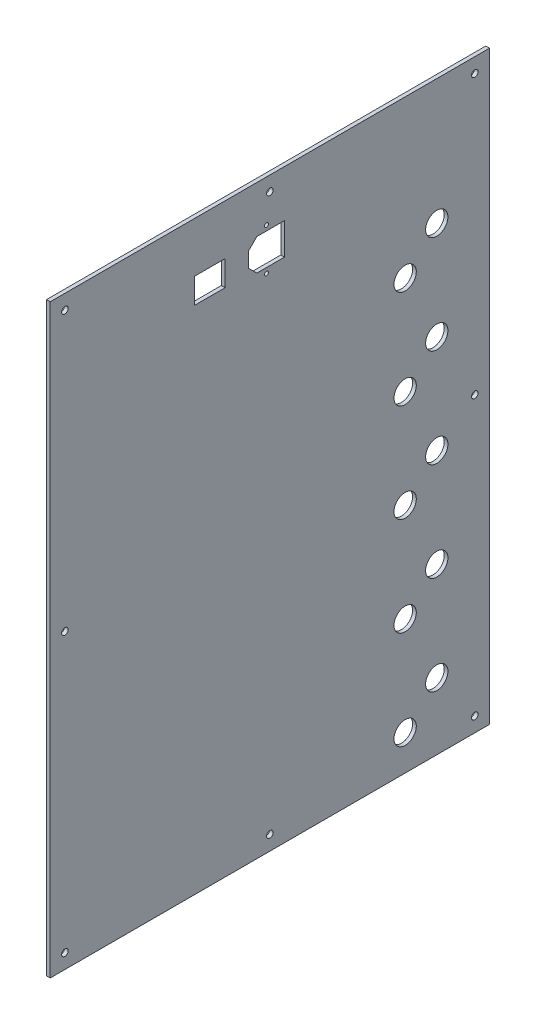
ISO-10303-21;
HEADER;
FILE_DESCRIPTION(('STEP AP214'),'2;1');
FILE_NAME('part.step','',(''),(''),'','','');
FILE_SCHEMA(('AUTOMOTIVE_DESIGN { 1 0 10303 214 1 1 1 1 }'));
ENDSEC;
DATA;
#1=APPLICATION_CONTEXT('core data for automotive mechanical design processes');
#2=APPLICATION_PROTOCOL_DEFINITION('international standard','automotive_design',2000,#1);
#3=PRODUCT_CONTEXT('',#1,'mechanical');
#4=PRODUCT('Part','Part','',(#3));
#5=PRODUCT_RELATED_PRODUCT_CATEGORY('part','',(#4));
#6=PRODUCT_DEFINITION_FORMATION('','',#4);
#7=PRODUCT_DEFINITION_CONTEXT('part definition',#1,'design');
#8=PRODUCT_DEFINITION('design','',#6,#7);
#9=PRODUCT_DEFINITION_SHAPE('','',#8);
#10=(LENGTH_UNIT() NAMED_UNIT(*) SI_UNIT(.MILLI.,.METRE.));
#11=(NAMED_UNIT(*) PLANE_ANGLE_UNIT() SI_UNIT($,.RADIAN.));
#12=(NAMED_UNIT(*) SI_UNIT($,.STERADIAN.) SOLID_ANGLE_UNIT());
#13=UNCERTAINTY_MEASURE_WITH_UNIT(LENGTH_MEASURE(1.E-05),#10,'distance_accuracy_value','');
#14=(GEOMETRIC_REPRESENTATION_CONTEXT(3) GLOBAL_UNCERTAINTY_ASSIGNED_CONTEXT((#13)) GLOBAL_UNIT_ASSIGNED_CONTEXT((#10,
#11,#12)) REPRESENTATION_CONTEXT('',''));
#15=CARTESIAN_POINT('',(0.,0.,0.));
#16=DIRECTION('',(0.,0.,1.));
#17=DIRECTION('',(1.,0.,0.));
#18=AXIS2_PLACEMENT_3D('',#15,#16,#17);
#19=CARTESIAN_POINT('',(3.175,0.,0.));
#20=DIRECTION('',(-1.,0.,0.));
#21=DIRECTION('',(0.,0.,1.));
#22=AXIS2_PLACEMENT_3D('',#19,#20,#21);
#23=PLANE('',#22);
#24=DIRECTION('',(0.,1.,0.));
#25=VECTOR('',#24,1.);
#26=CARTESIAN_POINT('',(3.175,207.25,38.234));
#27=LINE('',#26,#25);
#28=CARTESIAN_POINT('',(3.175,185.75,38.234));
#29=VERTEX_POINT('',#28);
#30=CARTESIAN_POINT('',(3.175,207.25,38.234));
#31=VERTEX_POINT('',#30);
#32=EDGE_CURVE('E181',#29,#31,#27,.T.);
#33=ORIENTED_EDGE('',*,*,#32,.F.);
#34=DIRECTION('',(0.,0.,-1.));
#35=VECTOR('',#34,1.);
#36=CARTESIAN_POINT('',(3.175,185.75,64.234));
#37=LINE('',#36,#35);
#38=CARTESIAN_POINT('',(3.175,185.75,64.234));
#39=VERTEX_POINT('',#38);
#40=EDGE_CURVE('E61',#39,#29,#37,.T.);
#41=ORIENTED_EDGE('',*,*,#40,.F.);
#42=DIRECTION('',(0.,-1.,0.));
#43=VECTOR('',#42,1.);
#44=CARTESIAN_POINT('',(3.175,207.25,64.234));
#45=LINE('',#44,#43);
#46=CARTESIAN_POINT('',(3.175,207.25,64.234));
#47=VERTEX_POINT('',#46);
#48=EDGE_CURVE('E168',#47,#39,#45,.T.);
#49=ORIENTED_EDGE('',*,*,#48,.F.);
#50=DIRECTION('',(0.,0.,1.));
#51=VECTOR('',#50,1.);
#52=CARTESIAN_POINT('',(3.175,207.25,64.234));
#53=LINE('',#52,#51);
#54=EDGE_CURVE('E172',#31,#47,#53,.T.);
#55=ORIENTED_EDGE('',*,*,#54,.F.);
#56=EDGE_LOOP('',(#33,#41,#49,#55));
#57=FACE_BOUND('',#56,.T.);
#58=CARTESIAN_POINT('',(3.175,178.593,2.89999999999999));
#59=DIRECTION('',(1.,0.,0.));
#60=DIRECTION('',(0.,0.,-1.));
#61=AXIS2_PLACEMENT_3D('',#58,#59,#60);
#62=CIRCLE('',#61,1.70000000000001);
#63=CARTESIAN_POINT('',(3.175,178.593,1.19999999999997));
#64=VERTEX_POINT('',#63);
#65=EDGE_CURVE('E201',#64,#64,#62,.T.);
#66=ORIENTED_EDGE('',*,*,#65,.F.);
#67=EDGE_LOOP('',(#66));
#68=FACE_BOUND('',#67,.T.);
#69=CARTESIAN_POINT('',(3.175,214.407,2.89999999999999));
#70=DIRECTION('',(1.,0.,0.));
#71=DIRECTION('',(0.,0.,-1.));
#72=AXIS2_PLACEMENT_3D('',#69,#70,#71);
#73=CIRCLE('',#72,1.70000000000001);
#74=CARTESIAN_POINT('',(3.175,214.407,1.19999999999998));
#75=VERTEX_POINT('',#74);
#76=EDGE_CURVE('E205',#75,#75,#73,.T.);
#77=ORIENTED_EDGE('',*,*,#76,.F.);
#78=EDGE_LOOP('',(#77));
#79=FACE_BOUND('',#78,.T.);
#80=DIRECTION('',(0.,-0.707106781186548,0.707106781186547));
#81=VECTOR('',#80,1.);
#82=CARTESIAN_POINT('',(3.175,210.,11.122));
#83=LINE('',#82,#81);
#84=CARTESIAN_POINT('',(3.175,210.,11.122));
#85=VERTEX_POINT('',#84);
#86=CARTESIAN_POINT('',(3.175,202.888,18.234));
#87=VERTEX_POINT('',#86);
#88=EDGE_CURVE('E240',#85,#87,#83,.T.);
#89=ORIENTED_EDGE('',*,*,#88,.F.);
#90=DIRECTION('',(0.,0.,1.));
#91=VECTOR('',#90,1.);
#92=CARTESIAN_POINT('',(3.175,210.,-12.5));
#93=LINE('',#92,#91);
#94=CARTESIAN_POINT('',(3.175,210.,-12.5));
#95=VERTEX_POINT('',#94);
#96=EDGE_CURVE('E200',#95,#85,#93,.T.);
#97=ORIENTED_EDGE('',*,*,#96,.F.);
#98=DIRECTION('',(0.,1.,0.));
#99=VECTOR('',#98,1.);
#100=CARTESIAN_POINT('',(3.175,210.,-12.5));
#101=LINE('',#100,#99);
#102=CARTESIAN_POINT('',(3.175,183.,-12.5));
#103=VERTEX_POINT('',#102);
#104=EDGE_CURVE('E217',#103,#95,#101,.T.);
#105=ORIENTED_EDGE('',*,*,#104,.F.);
#106=DIRECTION('',(0.,0.,-1.));
#107=VECTOR('',#106,1.);
#108=CARTESIAN_POINT('',(3.175,183.,-12.5));
#109=LINE('',#108,#107);
#110=CARTESIAN_POINT('',(3.175,183.,11.122));
#111=VERTEX_POINT('',#110);
#112=EDGE_CURVE('E252',#111,#103,#109,.T.);
#113=ORIENTED_EDGE('',*,*,#112,.F.);
#114=DIRECTION('',(0.,-0.707106781186548,-0.707106781186547));
#115=VECTOR('',#114,1.);
#116=CARTESIAN_POINT('',(3.175,190.112,18.234));
#117=LINE('',#116,#115);
#118=CARTESIAN_POINT('',(3.175,190.112,18.234));
#119=VERTEX_POINT('',#118);
#120=EDGE_CURVE('E248',#119,#111,#117,.T.);
#121=ORIENTED_EDGE('',*,*,#120,.F.);
#122=DIRECTION('',(0.,-1.,0.));
#123=VECTOR('',#122,1.);
#124=CARTESIAN_POINT('',(3.175,202.888,18.234));
#125=LINE('',#124,#123);
#126=EDGE_CURVE('E244',#87,#119,#125,.T.);
#127=ORIENTED_EDGE('',*,*,#126,.F.);
#128=EDGE_LOOP('',(#89,#97,#105,#113,#121,#127));
#129=FACE_BOUND('',#128,.T.);
#130=CARTESIAN_POINT('',(3.175,-220.,-115.5));
#131=DIRECTION('',(1.,0.,0.));
#132=DIRECTION('',(0.,0.,-1.));
#133=AXIS2_PLACEMENT_3D('',#130,#131,#132);
#134=CIRCLE('',#133,9.525);
#135=CARTESIAN_POINT('',(3.175,-220.,-125.025));
#136=VERTEX_POINT('',#135);
#137=EDGE_CURVE('E283',#136,#136,#134,.T.);
#138=ORIENTED_EDGE('',*,*,#137,.F.);
#139=EDGE_LOOP('',(#138));
#140=FACE_BOUND('',#139,.T.);
#141=CARTESIAN_POINT('',(3.175,-193.,-142.5));
#142=DIRECTION('',(1.,0.,0.));
#143=DIRECTION('',(0.,0.,-1.));
#144=AXIS2_PLACEMENT_3D('',#141,#142,#143);
#145=CIRCLE('',#144,9.52499999999999);
#146=CARTESIAN_POINT('',(3.175,-193.,-152.025));
#147=VERTEX_POINT('',#146);
#148=EDGE_CURVE('E287',#147,#147,#145,.T.);
#149=ORIENTED_EDGE('',*,*,#148,.F.);
#150=EDGE_LOOP('',(#149));
#151=FACE_BOUND('',#150,.T.);
#152=CARTESIAN_POINT('',(3.175,-136.,-115.5));
#153=DIRECTION('',(1.,0.,0.));
#154=DIRECTION('',(0.,0.,-1.));
#155=AXIS2_PLACEMENT_3D('',#152,#153,#154);
#156=CIRCLE('',#155,9.52500000000002);
#157=CARTESIAN_POINT('',(3.175,-136.,-125.025));
#158=VERTEX_POINT('',#157);
#159=EDGE_CURVE('E295',#158,#158,#156,.T.);
#160=ORIENTED_EDGE('',*,*,#159,.F.);
#161=EDGE_LOOP('',(#160));
#162=FACE_BOUND('',#161,.T.);
#163=CARTESIAN_POINT('',(3.175,-109.,-142.5));
#164=DIRECTION('',(1.,0.,0.));
#165=DIRECTION('',(0.,0.,-1.));
#166=AXIS2_PLACEMENT_3D('',#163,#164,#165);
#167=CIRCLE('',#166,9.52499999999999);
#168=CARTESIAN_POINT('',(3.175,-109.,-152.025));
#169=VERTEX_POINT('',#168);
#170=EDGE_CURVE('E303',#169,#169,#167,.T.);
#171=ORIENTED_EDGE('',*,*,#170,.F.);
#172=EDGE_LOOP('',(#171));
#173=FACE_BOUND('',#172,.T.);
#174=CARTESIAN_POINT('',(3.175,-52.,-115.5));
#175=DIRECTION('',(1.,0.,0.));
#176=DIRECTION('',(0.,0.,-1.));
#177=AXIS2_PLACEMENT_3D('',#174,#175,#176);
#178=CIRCLE('',#177,9.525);
#179=CARTESIAN_POINT('',(3.175,-52.,-125.025));
#180=VERTEX_POINT('',#179);
#181=EDGE_CURVE('E311',#180,#180,#178,.T.);
#182=ORIENTED_EDGE('',*,*,#181,.F.);
#183=EDGE_LOOP('',(#182));
#184=FACE_BOUND('',#183,.T.);
#185=CARTESIAN_POINT('',(3.175,-24.9999999999997,-142.5));
#186=DIRECTION('',(1.,0.,0.));
#187=DIRECTION('',(0.,0.,-1.));
#188=AXIS2_PLACEMENT_3D('',#185,#186,#187);
#189=CIRCLE('',#188,9.52499999999998);
#190=CARTESIAN_POINT('',(3.175,-24.9999999999997,-152.025));
#191=VERTEX_POINT('',#190);
#192=EDGE_CURVE('E319',#191,#191,#189,.T.);
#193=ORIENTED_EDGE('',*,*,#192,.F.);
#194=EDGE_LOOP('',(#193));
#195=FACE_BOUND('',#194,.T.);
#196=CARTESIAN_POINT('',(3.175,32.,-115.5));
#197=DIRECTION('',(1.,0.,0.));
#198=DIRECTION('',(0.,0.,-1.));
#199=AXIS2_PLACEMENT_3D('',#196,#197,#198);
#200=CIRCLE('',#199,9.525);
#201=CARTESIAN_POINT('',(3.175,32.,-125.025));
#202=VERTEX_POINT('',#201);
#203=EDGE_CURVE('E327',#202,#202,#200,.T.);
#204=ORIENTED_EDGE('',*,*,#203,.F.);
#205=EDGE_LOOP('',(#204));
#206=FACE_BOUND('',#205,.T.);
#207=CARTESIAN_POINT('',(3.175,59.0000000000003,-142.5));
#208=DIRECTION('',(1.,0.,0.));
#209=DIRECTION('',(0.,0.,-1.));
#210=AXIS2_PLACEMENT_3D('',#207,#208,#209);
#211=CIRCLE('',#210,9.52499999999999);
#212=CARTESIAN_POINT('',(3.175,59.0000000000003,-152.025));
#213=VERTEX_POINT('',#212);
#214=EDGE_CURVE('E335',#213,#213,#211,.T.);
#215=ORIENTED_EDGE('',*,*,#214,.F.);
#216=EDGE_LOOP('',(#215));
#217=FACE_BOUND('',#216,.T.);
#218=CARTESIAN_POINT('',(3.175,116.,-115.5));
#219=DIRECTION('',(1.,0.,0.));
#220=DIRECTION('',(0.,0.,-1.));
#221=AXIS2_PLACEMENT_3D('',#218,#219,#220);
#222=CIRCLE('',#221,9.525);
#223=CARTESIAN_POINT('',(3.175,116.,-125.025));
#224=VERTEX_POINT('',#223);
#225=EDGE_CURVE('E343',#224,#224,#222,.T.);
#226=ORIENTED_EDGE('',*,*,#225,.F.);
#227=EDGE_LOOP('',(#226));
#228=FACE_BOUND('',#227,.T.);
#229=CARTESIAN_POINT('',(3.175,143.,-142.5));
#230=DIRECTION('',(1.,0.,0.));
#231=DIRECTION('',(0.,0.,-1.));
#232=AXIS2_PLACEMENT_3D('',#229,#230,#231);
#233=CIRCLE('',#232,9.52499999999999);
#234=CARTESIAN_POINT('',(3.175,143.,-152.025));
#235=VERTEX_POINT('',#234);
#236=EDGE_CURVE('E351',#235,#235,#233,.T.);
#237=ORIENTED_EDGE('',*,*,#236,.F.);
#238=EDGE_LOOP('',(#237));
#239=FACE_BOUND('',#238,.T.);
#240=DIRECTION('',(0.,0.,1.));
#241=VECTOR('',#240,1.);
#242=CARTESIAN_POINT('',(3.175,250.,-187.5));
#243=LINE('',#242,#241);
#244=CARTESIAN_POINT('',(3.175,250.,-187.5));
#245=VERTEX_POINT('',#244);
#246=CARTESIAN_POINT('',(3.175,250.,187.5));
#247=VERTEX_POINT('',#246);
#248=EDGE_CURVE('E422',#245,#247,#243,.T.);
#249=ORIENTED_EDGE('',*,*,#248,.T.);
#250=DIRECTION('',(0.,-1.,0.));
#251=VECTOR('',#250,1.);
#252=CARTESIAN_POINT('',(3.175,-250.,187.5));
#253=LINE('',#252,#251);
#254=CARTESIAN_POINT('',(3.175,-250.,187.5));
#255=VERTEX_POINT('',#254);
#256=EDGE_CURVE('E426',#247,#255,#253,.T.);
#257=ORIENTED_EDGE('',*,*,#256,.T.);
#258=DIRECTION('',(0.,0.,-1.));
#259=VECTOR('',#258,1.);
#260=CARTESIAN_POINT('',(3.175,-250.,-187.5));
#261=LINE('',#260,#259);
#262=CARTESIAN_POINT('',(3.175,-250.,-187.5));
#263=VERTEX_POINT('',#262);
#264=EDGE_CURVE('E430',#255,#263,#261,.T.);
#265=ORIENTED_EDGE('',*,*,#264,.T.);
#266=DIRECTION('',(0.,1.,0.));
#267=VECTOR('',#266,1.);
#268=CARTESIAN_POINT('',(3.175,-250.,-187.5));
#269=LINE('',#268,#267);
#270=EDGE_CURVE('E433',#263,#245,#269,.T.);
#271=ORIENTED_EDGE('',*,*,#270,.T.);
#272=EDGE_LOOP('',(#249,#257,#265,#271));
#273=FACE_BOUND('',#272,.T.);
#274=CARTESIAN_POINT('',(3.175,-237.5,175.));
#275=DIRECTION('',(1.,0.,0.));
#276=DIRECTION('',(0.,0.,-1.));
#277=AXIS2_PLACEMENT_3D('',#274,#275,#276);
#278=CIRCLE('',#277,2.8);
#279=CARTESIAN_POINT('',(3.175,-237.5,172.2));
#280=VERTEX_POINT('',#279);
#281=EDGE_CURVE('E414',#280,#280,#278,.T.);
#282=ORIENTED_EDGE('',*,*,#281,.F.);
#283=EDGE_LOOP('',(#282));
#284=FACE_BOUND('',#283,.T.);
#285=CARTESIAN_POINT('',(3.175,237.5,175.));
#286=DIRECTION('',(1.,0.,0.));
#287=DIRECTION('',(0.,0.,-1.));
#288=AXIS2_PLACEMENT_3D('',#285,#286,#287);
#289=CIRCLE('',#288,2.8);
#290=CARTESIAN_POINT('',(3.175,237.5,172.2));
#291=VERTEX_POINT('',#290);
#292=EDGE_CURVE('E406',#291,#291,#289,.T.);
#293=ORIENTED_EDGE('',*,*,#292,.F.);
#294=EDGE_LOOP('',(#293));
#295=FACE_BOUND('',#294,.T.);
#296=CARTESIAN_POINT('',(3.175,237.5,-175.));
#297=DIRECTION('',(1.,0.,0.));
#298=DIRECTION('',(0.,0.,-1.));
#299=AXIS2_PLACEMENT_3D('',#296,#297,#298);
#300=CIRCLE('',#299,2.8);
#301=CARTESIAN_POINT('',(3.175,237.5,-177.8));
#302=VERTEX_POINT('',#301);
#303=EDGE_CURVE('E398',#302,#302,#300,.T.);
#304=ORIENTED_EDGE('',*,*,#303,.F.);
#305=EDGE_LOOP('',(#304));
#306=FACE_BOUND('',#305,.T.);
#307=CARTESIAN_POINT('',(3.175,-237.5,-175.));
#308=DIRECTION('',(1.,0.,0.));
#309=DIRECTION('',(0.,0.,-1.));
#310=AXIS2_PLACEMENT_3D('',#307,#308,#309);
#311=CIRCLE('',#310,2.8);
#312=CARTESIAN_POINT('',(3.175,-237.5,-177.8));
#313=VERTEX_POINT('',#312);
#314=EDGE_CURVE('E390',#313,#313,#311,.T.);
#315=ORIENTED_EDGE('',*,*,#314,.F.);
#316=EDGE_LOOP('',(#315));
#317=FACE_BOUND('',#316,.T.);
#318=CARTESIAN_POINT('',(3.175,-237.5,0.));
#319=DIRECTION('',(1.,0.,0.));
#320=DIRECTION('',(0.,0.,-1.));
#321=AXIS2_PLACEMENT_3D('',#318,#319,#320);
#322=CIRCLE('',#321,2.80000000000001);
#323=CARTESIAN_POINT('',(3.175,-237.5,-2.79999999999998));
#324=VERTEX_POINT('',#323);
#325=EDGE_CURVE('E382',#324,#324,#322,.T.);
#326=ORIENTED_EDGE('',*,*,#325,.F.);
#327=EDGE_LOOP('',(#326));
#328=FACE_BOUND('',#327,.T.);
#329=CARTESIAN_POINT('',(3.175,0.,175.));
#330=DIRECTION('',(1.,0.,0.));
#331=DIRECTION('',(0.,0.,-1.));
#332=AXIS2_PLACEMENT_3D('',#329,#330,#331);
#333=CIRCLE('',#332,2.8);
#334=CARTESIAN_POINT('',(3.175,0.,172.2));
#335=VERTEX_POINT('',#334);
#336=EDGE_CURVE('E374',#335,#335,#333,.T.);
#337=ORIENTED_EDGE('',*,*,#336,.F.);
#338=EDGE_LOOP('',(#337));
#339=FACE_BOUND('',#338,.T.);
#340=CARTESIAN_POINT('',(3.175,237.5,0.));
#341=DIRECTION('',(1.,0.,0.));
#342=DIRECTION('',(0.,0.,-1.));
#343=AXIS2_PLACEMENT_3D('',#340,#341,#342);
#344=CIRCLE('',#343,2.80000000000001);
#345=CARTESIAN_POINT('',(3.175,237.5,-2.79999999999998));
#346=VERTEX_POINT('',#345);
#347=EDGE_CURVE('E366',#346,#346,#344,.T.);
#348=ORIENTED_EDGE('',*,*,#347,.F.);
#349=EDGE_LOOP('',(#348));
#350=FACE_BOUND('',#349,.T.);
#351=CARTESIAN_POINT('',(3.175,0.,-175.));
#352=DIRECTION('',(1.,0.,0.));
#353=DIRECTION('',(0.,0.,-1.));
#354=AXIS2_PLACEMENT_3D('',#351,#352,#353);
#355=CIRCLE('',#354,2.8);
#356=CARTESIAN_POINT('',(3.175,0.,-177.8));
#357=VERTEX_POINT('',#356);
#358=EDGE_CURVE('E358',#357,#357,#355,.T.);
#359=ORIENTED_EDGE('',*,*,#358,.F.);
#360=EDGE_LOOP('',(#359));
#361=FACE_BOUND('',#360,.T.);
#362=ADVANCED_FACE('F45',(#57,#68,#79,#129,#140,#151,#162,#173,#184,#195,#206,#217,#228,#239,
#273,#284,#295,#306,#317,#328,#339,#350,#361),#23,.F.);
#363=CARTESIAN_POINT('',(0.,0.,0.));
#364=DIRECTION('',(-1.,0.,0.));
#365=DIRECTION('',(0.,0.,1.));
#366=AXIS2_PLACEMENT_3D('',#363,#364,#365);
#367=PLANE('',#366);
#368=DIRECTION('',(0.,0.,-1.));
#369=VECTOR('',#368,1.);
#370=CARTESIAN_POINT('',(0.,185.75,64.234));
#371=LINE('',#370,#369);
#372=CARTESIAN_POINT('',(0.,185.75,64.234));
#373=VERTEX_POINT('',#372);
#374=CARTESIAN_POINT('',(0.,185.75,38.234));
#375=VERTEX_POINT('',#374);
#376=EDGE_CURVE('E149',#373,#375,#371,.T.);
#377=ORIENTED_EDGE('',*,*,#376,.T.);
#378=DIRECTION('',(0.,1.,0.));
#379=VECTOR('',#378,1.);
#380=CARTESIAN_POINT('',(0.,207.25,38.234));
#381=LINE('',#380,#379);
#382=CARTESIAN_POINT('',(0.,207.25,38.234));
#383=VERTEX_POINT('',#382);
#384=EDGE_CURVE('E159',#375,#383,#381,.T.);
#385=ORIENTED_EDGE('',*,*,#384,.T.);
#386=DIRECTION('',(0.,0.,1.));
#387=VECTOR('',#386,1.);
#388=CARTESIAN_POINT('',(0.,207.25,64.234));
#389=LINE('',#388,#387);
#390=CARTESIAN_POINT('',(0.,207.25,64.234));
#391=VERTEX_POINT('',#390);
#392=EDGE_CURVE('E69',#383,#391,#389,.T.);
#393=ORIENTED_EDGE('',*,*,#392,.T.);
#394=DIRECTION('',(0.,-1.,0.));
#395=VECTOR('',#394,1.);
#396=CARTESIAN_POINT('',(0.,207.25,64.234));
#397=LINE('',#396,#395);
#398=EDGE_CURVE('E156',#391,#373,#397,.T.);
#399=ORIENTED_EDGE('',*,*,#398,.T.);
#400=EDGE_LOOP('',(#377,#385,#393,#399));
#401=FACE_BOUND('',#400,.T.);
#402=CARTESIAN_POINT('',(0.,178.593,2.89999999999999));
#403=DIRECTION('',(1.,0.,0.));
#404=DIRECTION('',(0.,0.,-1.));
#405=AXIS2_PLACEMENT_3D('',#402,#403,#404);
#406=CIRCLE('',#405,1.70000000000001);
#407=CARTESIAN_POINT('',(0.,178.593,1.19999999999997));
#408=VERTEX_POINT('',#407);
#409=EDGE_CURVE('E196',#408,#408,#406,.T.);
#410=ORIENTED_EDGE('',*,*,#409,.T.);
#411=EDGE_LOOP('',(#410));
#412=FACE_BOUND('',#411,.T.);
#413=CARTESIAN_POINT('',(0.,214.407,2.89999999999999));
#414=DIRECTION('',(1.,0.,0.));
#415=DIRECTION('',(0.,0.,-1.));
#416=AXIS2_PLACEMENT_3D('',#413,#414,#415);
#417=CIRCLE('',#416,1.70000000000001);
#418=CARTESIAN_POINT('',(0.,214.407,1.19999999999998));
#419=VERTEX_POINT('',#418);
#420=EDGE_CURVE('E190',#419,#419,#417,.T.);
#421=ORIENTED_EDGE('',*,*,#420,.T.);
#422=EDGE_LOOP('',(#421));
#423=FACE_BOUND('',#422,.T.);
#424=DIRECTION('',(0.,0.,1.));
#425=VECTOR('',#424,1.);
#426=CARTESIAN_POINT('',(0.,210.,-12.5));
#427=LINE('',#426,#425);
#428=CARTESIAN_POINT('',(0.,210.,-12.5));
#429=VERTEX_POINT('',#428);
#430=CARTESIAN_POINT('',(0.,210.,11.122));
#431=VERTEX_POINT('',#430);
#432=EDGE_CURVE('E212',#429,#431,#427,.T.);
#433=ORIENTED_EDGE('',*,*,#432,.T.);
#434=DIRECTION('',(0.,-0.707106781186548,0.707106781186547));
#435=VECTOR('',#434,1.);
#436=CARTESIAN_POINT('',(0.,210.,11.122));
#437=LINE('',#436,#435);
#438=CARTESIAN_POINT('',(0.,202.888,18.234));
#439=VERTEX_POINT('',#438);
#440=EDGE_CURVE('E216',#431,#439,#437,.T.);
#441=ORIENTED_EDGE('',*,*,#440,.T.);
#442=DIRECTION('',(0.,-1.,0.));
#443=VECTOR('',#442,1.);
#444=CARTESIAN_POINT('',(0.,202.888,18.234));
#445=LINE('',#444,#443);
#446=CARTESIAN_POINT('',(0.,190.112,18.234));
#447=VERTEX_POINT('',#446);
#448=EDGE_CURVE('E221',#439,#447,#445,.T.);
#449=ORIENTED_EDGE('',*,*,#448,.T.);
#450=DIRECTION('',(0.,-0.707106781186548,-0.707106781186547));
#451=VECTOR('',#450,1.);
#452=CARTESIAN_POINT('',(0.,190.112,18.234));
#453=LINE('',#452,#451);
#454=CARTESIAN_POINT('',(0.,183.,11.122));
#455=VERTEX_POINT('',#454);
#456=EDGE_CURVE('E225',#447,#455,#453,.T.);
#457=ORIENTED_EDGE('',*,*,#456,.T.);
#458=DIRECTION('',(0.,0.,-1.));
#459=VECTOR('',#458,1.);
#460=CARTESIAN_POINT('',(0.,183.,-12.5));
#461=LINE('',#460,#459);
#462=CARTESIAN_POINT('',(0.,183.,-12.5));
#463=VERTEX_POINT('',#462);
#464=EDGE_CURVE('E229',#455,#463,#461,.T.);
#465=ORIENTED_EDGE('',*,*,#464,.T.);
#466=DIRECTION('',(0.,1.,0.));
#467=VECTOR('',#466,1.);
#468=CARTESIAN_POINT('',(0.,210.,-12.5));
#469=LINE('',#468,#467);
#470=EDGE_CURVE('E233',#463,#429,#469,.T.);
#471=ORIENTED_EDGE('',*,*,#470,.T.);
#472=EDGE_LOOP('',(#433,#441,#449,#457,#465,#471));
#473=FACE_BOUND('',#472,.T.);
#474=CARTESIAN_POINT('',(0.,-220.,-115.5));
#475=DIRECTION('',(1.,0.,0.));
#476=DIRECTION('',(0.,0.,-1.));
#477=AXIS2_PLACEMENT_3D('',#474,#475,#476);
#478=CIRCLE('',#477,9.525);
#479=CARTESIAN_POINT('',(0.,-220.,-125.025));
#480=VERTEX_POINT('',#479);
#481=EDGE_CURVE('E278',#480,#480,#478,.T.);
#482=ORIENTED_EDGE('',*,*,#481,.T.);
#483=EDGE_LOOP('',(#482));
#484=FACE_BOUND('',#483,.T.);
#485=CARTESIAN_POINT('',(0.,-193.,-142.5));
#486=DIRECTION('',(1.,0.,0.));
#487=DIRECTION('',(0.,0.,-1.));
#488=AXIS2_PLACEMENT_3D('',#485,#486,#487);
#489=CIRCLE('',#488,9.52499999999999);
#490=CARTESIAN_POINT('',(0.,-193.,-152.025));
#491=VERTEX_POINT('',#490);
#492=EDGE_CURVE('E291',#491,#491,#489,.T.);
#493=ORIENTED_EDGE('',*,*,#492,.T.);
#494=EDGE_LOOP('',(#493));
#495=FACE_BOUND('',#494,.T.);
#496=CARTESIAN_POINT('',(0.,-136.,-115.5));
#497=DIRECTION('',(1.,0.,0.));
#498=DIRECTION('',(0.,0.,-1.));
#499=AXIS2_PLACEMENT_3D('',#496,#497,#498);
#500=CIRCLE('',#499,9.52500000000002);
#501=CARTESIAN_POINT('',(0.,-136.,-125.025));
#502=VERTEX_POINT('',#501);
#503=EDGE_CURVE('E299',#502,#502,#500,.T.);
#504=ORIENTED_EDGE('',*,*,#503,.T.);
#505=EDGE_LOOP('',(#504));
#506=FACE_BOUND('',#505,.T.);
#507=CARTESIAN_POINT('',(0.,-109.,-142.5));
#508=DIRECTION('',(1.,0.,0.));
#509=DIRECTION('',(0.,0.,-1.));
#510=AXIS2_PLACEMENT_3D('',#507,#508,#509);
#511=CIRCLE('',#510,9.52499999999999);
#512=CARTESIAN_POINT('',(0.,-109.,-152.025));
#513=VERTEX_POINT('',#512);
#514=EDGE_CURVE('E307',#513,#513,#511,.T.);
#515=ORIENTED_EDGE('',*,*,#514,.T.);
#516=EDGE_LOOP('',(#515));
#517=FACE_BOUND('',#516,.T.);
#518=CARTESIAN_POINT('',(0.,-52.,-115.5));
#519=DIRECTION('',(1.,0.,0.));
#520=DIRECTION('',(0.,0.,-1.));
#521=AXIS2_PLACEMENT_3D('',#518,#519,#520);
#522=CIRCLE('',#521,9.525);
#523=CARTESIAN_POINT('',(0.,-52.,-125.025));
#524=VERTEX_POINT('',#523);
#525=EDGE_CURVE('E315',#524,#524,#522,.T.);
#526=ORIENTED_EDGE('',*,*,#525,.T.);
#527=EDGE_LOOP('',(#526));
#528=FACE_BOUND('',#527,.T.);
#529=CARTESIAN_POINT('',(0.,-24.9999999999997,-142.5));
#530=DIRECTION('',(1.,0.,0.));
#531=DIRECTION('',(0.,0.,-1.));
#532=AXIS2_PLACEMENT_3D('',#529,#530,#531);
#533=CIRCLE('',#532,9.52499999999998);
#534=CARTESIAN_POINT('',(0.,-24.9999999999997,-152.025));
#535=VERTEX_POINT('',#534);
#536=EDGE_CURVE('E323',#535,#535,#533,.T.);
#537=ORIENTED_EDGE('',*,*,#536,.T.);
#538=EDGE_LOOP('',(#537));
#539=FACE_BOUND('',#538,.T.);
#540=CARTESIAN_POINT('',(0.,32.,-115.5));
#541=DIRECTION('',(1.,0.,0.));
#542=DIRECTION('',(0.,0.,-1.));
#543=AXIS2_PLACEMENT_3D('',#540,#541,#542);
#544=CIRCLE('',#543,9.525);
#545=CARTESIAN_POINT('',(0.,32.,-125.025));
#546=VERTEX_POINT('',#545);
#547=EDGE_CURVE('E331',#546,#546,#544,.T.);
#548=ORIENTED_EDGE('',*,*,#547,.T.);
#549=EDGE_LOOP('',(#548));
#550=FACE_BOUND('',#549,.T.);
#551=CARTESIAN_POINT('',(0.,59.0000000000003,-142.5));
#552=DIRECTION('',(1.,0.,0.));
#553=DIRECTION('',(0.,0.,-1.));
#554=AXIS2_PLACEMENT_3D('',#551,#552,#553);
#555=CIRCLE('',#554,9.52499999999999);
#556=CARTESIAN_POINT('',(0.,59.0000000000003,-152.025));
#557=VERTEX_POINT('',#556);
#558=EDGE_CURVE('E339',#557,#557,#555,.T.);
#559=ORIENTED_EDGE('',*,*,#558,.T.);
#560=EDGE_LOOP('',(#559));
#561=FACE_BOUND('',#560,.T.);
#562=CARTESIAN_POINT('',(0.,116.,-115.5));
#563=DIRECTION('',(1.,0.,0.));
#564=DIRECTION('',(0.,0.,-1.));
#565=AXIS2_PLACEMENT_3D('',#562,#563,#564);
#566=CIRCLE('',#565,9.525);
#567=CARTESIAN_POINT('',(0.,116.,-125.025));
#568=VERTEX_POINT('',#567);
#569=EDGE_CURVE('E347',#568,#568,#566,.T.);
#570=ORIENTED_EDGE('',*,*,#569,.T.);
#571=EDGE_LOOP('',(#570));
#572=FACE_BOUND('',#571,.T.);
#573=CARTESIAN_POINT('',(0.,143.,-142.5));
#574=DIRECTION('',(1.,0.,0.));
#575=DIRECTION('',(0.,0.,-1.));
#576=AXIS2_PLACEMENT_3D('',#573,#574,#575);
#577=CIRCLE('',#576,9.52499999999999);
#578=CARTESIAN_POINT('',(0.,143.,-152.025));
#579=VERTEX_POINT('',#578);
#580=EDGE_CURVE('E262',#579,#579,#577,.T.);
#581=ORIENTED_EDGE('',*,*,#580,.T.);
#582=EDGE_LOOP('',(#581));
#583=FACE_BOUND('',#582,.T.);
#584=CARTESIAN_POINT('',(0.,237.5,0.));
#585=DIRECTION('',(1.,0.,0.));
#586=DIRECTION('',(0.,0.,-1.));
#587=AXIS2_PLACEMENT_3D('',#584,#585,#586);
#588=CIRCLE('',#587,2.80000000000001);
#589=CARTESIAN_POINT('',(0.,237.5,-2.79999999999998));
#590=VERTEX_POINT('',#589);
#591=EDGE_CURVE('E362',#590,#590,#588,.T.);
#592=ORIENTED_EDGE('',*,*,#591,.T.);
#593=EDGE_LOOP('',(#592));
#594=FACE_BOUND('',#593,.T.);
#595=CARTESIAN_POINT('',(0.,-237.5,0.));
#596=DIRECTION('',(1.,0.,0.));
#597=DIRECTION('',(0.,0.,-1.));
#598=AXIS2_PLACEMENT_3D('',#595,#596,#597);
#599=CIRCLE('',#598,2.80000000000001);
#600=CARTESIAN_POINT('',(0.,-237.5,-2.79999999999998));
#601=VERTEX_POINT('',#600);
#602=EDGE_CURVE('E378',#601,#601,#599,.T.);
#603=ORIENTED_EDGE('',*,*,#602,.T.);
#604=EDGE_LOOP('',(#603));
#605=FACE_BOUND('',#604,.T.);
#606=CARTESIAN_POINT('',(0.,237.5,-175.));
#607=DIRECTION('',(1.,0.,0.));
#608=DIRECTION('',(0.,0.,-1.));
#609=AXIS2_PLACEMENT_3D('',#606,#607,#608);
#610=CIRCLE('',#609,2.8);
#611=CARTESIAN_POINT('',(0.,237.5,-177.8));
#612=VERTEX_POINT('',#611);
#613=EDGE_CURVE('E394',#612,#612,#610,.T.);
#614=ORIENTED_EDGE('',*,*,#613,.T.);
#615=EDGE_LOOP('',(#614));
#616=FACE_BOUND('',#615,.T.);
#617=CARTESIAN_POINT('',(0.,-237.5,175.));
#618=DIRECTION('',(1.,0.,0.));
#619=DIRECTION('',(0.,0.,-1.));
#620=AXIS2_PLACEMENT_3D('',#617,#618,#619);
#621=CIRCLE('',#620,2.8);
#622=CARTESIAN_POINT('',(0.,-237.5,172.2));
#623=VERTEX_POINT('',#622);
#624=EDGE_CURVE('E410',#623,#623,#621,.T.);
#625=ORIENTED_EDGE('',*,*,#624,.T.);
#626=EDGE_LOOP('',(#625));
#627=FACE_BOUND('',#626,.T.);
#628=DIRECTION('',(0.,0.,1.));
#629=VECTOR('',#628,1.);
#630=CARTESIAN_POINT('',(0.,250.,-187.5));
#631=LINE('',#630,#629);
#632=CARTESIAN_POINT('',(0.,250.,-187.5));
#633=VERTEX_POINT('',#632);
#634=CARTESIAN_POINT('',(0.,250.,187.5));
#635=VERTEX_POINT('',#634);
#636=EDGE_CURVE('E418',#633,#635,#631,.T.);
#637=ORIENTED_EDGE('',*,*,#636,.F.);
#638=DIRECTION('',(0.,1.,0.));
#639=VECTOR('',#638,1.);
#640=CARTESIAN_POINT('',(0.,-250.,-187.5));
#641=LINE('',#640,#639);
#642=CARTESIAN_POINT('',(0.,-250.,-187.5));
#643=VERTEX_POINT('',#642);
#644=EDGE_CURVE('E427',#643,#633,#641,.T.);
#645=ORIENTED_EDGE('',*,*,#644,.F.);
#646=DIRECTION('',(0.,0.,-1.));
#647=VECTOR('',#646,1.);
#648=CARTESIAN_POINT('',(0.,-250.,-187.5));
#649=LINE('',#648,#647);
#650=CARTESIAN_POINT('',(0.,-250.,187.5));
#651=VERTEX_POINT('',#650);
#652=EDGE_CURVE('E443',#651,#643,#649,.T.);
#653=ORIENTED_EDGE('',*,*,#652,.F.);
#654=DIRECTION('',(0.,-1.,0.));
#655=VECTOR('',#654,1.);
#656=CARTESIAN_POINT('',(0.,-250.,187.5));
#657=LINE('',#656,#655);
#658=EDGE_CURVE('E440',#635,#651,#657,.T.);
#659=ORIENTED_EDGE('',*,*,#658,.F.);
#660=EDGE_LOOP('',(#637,#645,#653,#659));
#661=FACE_BOUND('',#660,.T.);
#662=CARTESIAN_POINT('',(0.,237.5,175.));
#663=DIRECTION('',(1.,0.,0.));
#664=DIRECTION('',(0.,0.,-1.));
#665=AXIS2_PLACEMENT_3D('',#662,#663,#664);
#666=CIRCLE('',#665,2.8);
#667=CARTESIAN_POINT('',(0.,237.5,172.2));
#668=VERTEX_POINT('',#667);
#669=EDGE_CURVE('E402',#668,#668,#666,.T.);
#670=ORIENTED_EDGE('',*,*,#669,.T.);
#671=EDGE_LOOP('',(#670));
#672=FACE_BOUND('',#671,.T.);
#673=CARTESIAN_POINT('',(0.,-237.5,-175.));
#674=DIRECTION('',(1.,0.,0.));
#675=DIRECTION('',(0.,0.,-1.));
#676=AXIS2_PLACEMENT_3D('',#673,#674,#675);
#677=CIRCLE('',#676,2.8);
#678=CARTESIAN_POINT('',(0.,-237.5,-177.8));
#679=VERTEX_POINT('',#678);
#680=EDGE_CURVE('E386',#679,#679,#677,.T.);
#681=ORIENTED_EDGE('',*,*,#680,.T.);
#682=EDGE_LOOP('',(#681));
#683=FACE_BOUND('',#682,.T.);
#684=CARTESIAN_POINT('',(0.,0.,175.));
#685=DIRECTION('',(1.,0.,0.));
#686=DIRECTION('',(0.,0.,-1.));
#687=AXIS2_PLACEMENT_3D('',#684,#685,#686);
#688=CIRCLE('',#687,2.8);
#689=CARTESIAN_POINT('',(0.,0.,172.2));
#690=VERTEX_POINT('',#689);
#691=EDGE_CURVE('E370',#690,#690,#688,.T.);
#692=ORIENTED_EDGE('',*,*,#691,.T.);
#693=EDGE_LOOP('',(#692));
#694=FACE_BOUND('',#693,.T.);
#695=CARTESIAN_POINT('',(0.,0.,-175.));
#696=DIRECTION('',(1.,0.,0.));
#697=DIRECTION('',(0.,0.,-1.));
#698=AXIS2_PLACEMENT_3D('',#695,#696,#697);
#699=CIRCLE('',#698,2.8);
#700=CARTESIAN_POINT('',(0.,0.,-177.8));
#701=VERTEX_POINT('',#700);
#702=EDGE_CURVE('E282',#701,#701,#699,.T.);
#703=ORIENTED_EDGE('',*,*,#702,.T.);
#704=EDGE_LOOP('',(#703));
#705=FACE_BOUND('',#704,.T.);
#706=ADVANCED_FACE('F164',(#401,#412,#423,#473,#484,#495,#506,#517,#528,#539,#550,#561,#572,
#583,#594,#605,#616,#627,#661,#672,#683,#694,#705),#367,.T.);
#707=CARTESIAN_POINT('',(3.175,250.,-187.5));
#708=DIRECTION('',(0.,-1.,0.));
#709=DIRECTION('',(0.,0.,-1.));
#710=AXIS2_PLACEMENT_3D('',#707,#708,#709);
#711=PLANE('',#710);
#712=ORIENTED_EDGE('',*,*,#636,.T.);
#713=DIRECTION('',(-1.,0.,0.));
#714=VECTOR('',#713,1.);
#715=CARTESIAN_POINT('',(3.175,250.,187.5));
#716=LINE('',#715,#714);
#717=EDGE_CURVE('E11',#247,#635,#716,.T.);
#718=ORIENTED_EDGE('',*,*,#717,.F.);
#719=ORIENTED_EDGE('',*,*,#248,.F.);
#720=DIRECTION('',(-1.,0.,0.));
#721=VECTOR('',#720,1.);
#722=CARTESIAN_POINT('',(3.175,250.,-187.5));
#723=LINE('',#722,#721);
#724=EDGE_CURVE('E436',#245,#633,#723,.T.);
#725=ORIENTED_EDGE('',*,*,#724,.T.);
#726=EDGE_LOOP('',(#712,#718,#719,#725));
#727=FACE_BOUND('',#726,.T.);
#728=ADVANCED_FACE('F47',(#727),#711,.F.);
#729=CARTESIAN_POINT('',(3.175,-250.,187.5));
#730=DIRECTION('',(0.,0.,-1.));
#731=DIRECTION('',(-1.,0.,0.));
#732=AXIS2_PLACEMENT_3D('',#729,#730,#731);
#733=PLANE('',#732);
#734=ORIENTED_EDGE('',*,*,#658,.T.);
#735=DIRECTION('',(-1.,0.,0.));
#736=VECTOR('',#735,1.);
#737=CARTESIAN_POINT('',(3.175,-250.,187.5));
#738=LINE('',#737,#736);
#739=EDGE_CURVE('E54',#255,#651,#738,.T.);
#740=ORIENTED_EDGE('',*,*,#739,.F.);
#741=ORIENTED_EDGE('',*,*,#256,.F.);
#742=ORIENTED_EDGE('',*,*,#717,.T.);
#743=EDGE_LOOP('',(#734,#740,#741,#742));
#744=FACE_BOUND('',#743,.T.);
#745=ADVANCED_FACE('F476',(#744),#733,.F.);
#746=CARTESIAN_POINT('',(3.175,-250.,-187.5));
#747=DIRECTION('',(0.,1.,0.));
#748=DIRECTION('',(0.,0.,1.));
#749=AXIS2_PLACEMENT_3D('',#746,#747,#748);
#750=PLANE('',#749);
#751=ORIENTED_EDGE('',*,*,#652,.T.);
#752=DIRECTION('',(-1.,0.,0.));
#753=VECTOR('',#752,1.);
#754=CARTESIAN_POINT('',(3.175,-250.,-187.5));
#755=LINE('',#754,#753);
#756=EDGE_CURVE('E451',#263,#643,#755,.T.);
#757=ORIENTED_EDGE('',*,*,#756,.F.);
#758=ORIENTED_EDGE('',*,*,#264,.F.);
#759=ORIENTED_EDGE('',*,*,#739,.T.);
#760=EDGE_LOOP('',(#751,#757,#758,#759));
#761=FACE_BOUND('',#760,.T.);
#762=ADVANCED_FACE('F460',(#761),#750,.F.);
#763=CARTESIAN_POINT('',(3.175,-250.,-187.5));
#764=DIRECTION('',(0.,0.,1.));
#765=DIRECTION('',(1.,0.,0.));
#766=AXIS2_PLACEMENT_3D('',#763,#764,#765);
#767=PLANE('',#766);
#768=ORIENTED_EDGE('',*,*,#644,.T.);
#769=ORIENTED_EDGE('',*,*,#724,.F.);
#770=ORIENTED_EDGE('',*,*,#270,.F.);
#771=ORIENTED_EDGE('',*,*,#756,.T.);
#772=EDGE_LOOP('',(#768,#769,#770,#771));
#773=FACE_BOUND('',#772,.T.);
#774=ADVANCED_FACE('F469',(#773),#767,.F.);
#775=CARTESIAN_POINT('',(3.175,-237.5,175.));
#776=DIRECTION('',(-1.,0.,0.));
#777=DIRECTION('',(0.,0.,1.));
#778=AXIS2_PLACEMENT_3D('',#775,#776,#777);
#779=CYLINDRICAL_SURFACE('',#778,2.8);
#780=ORIENTED_EDGE('',*,*,#281,.T.);
#781=EDGE_LOOP('',(#780));
#782=FACE_BOUND('',#781,.T.);
#783=ORIENTED_EDGE('',*,*,#624,.F.);
#784=EDGE_LOOP('',(#783));
#785=FACE_BOUND('',#784,.T.);
#786=ADVANCED_FACE('F493',(#782,#785),#779,.F.);
#787=CARTESIAN_POINT('',(3.175,237.5,175.));
#788=DIRECTION('',(-1.,0.,0.));
#789=DIRECTION('',(0.,0.,1.));
#790=AXIS2_PLACEMENT_3D('',#787,#788,#789);
#791=CYLINDRICAL_SURFACE('',#790,2.8);
#792=ORIENTED_EDGE('',*,*,#292,.T.);
#793=EDGE_LOOP('',(#792));
#794=FACE_BOUND('',#793,.T.);
#795=ORIENTED_EDGE('',*,*,#669,.F.);
#796=EDGE_LOOP('',(#795));
#797=FACE_BOUND('',#796,.T.);
#798=ADVANCED_FACE('F500',(#794,#797),#791,.F.);
#799=CARTESIAN_POINT('',(3.175,237.5,-175.));
#800=DIRECTION('',(-1.,0.,0.));
#801=DIRECTION('',(0.,0.,1.));
#802=AXIS2_PLACEMENT_3D('',#799,#800,#801);
#803=CYLINDRICAL_SURFACE('',#802,2.8);
#804=ORIENTED_EDGE('',*,*,#303,.T.);
#805=EDGE_LOOP('',(#804));
#806=FACE_BOUND('',#805,.T.);
#807=ORIENTED_EDGE('',*,*,#613,.F.);
#808=EDGE_LOOP('',(#807));
#809=FACE_BOUND('',#808,.T.);
#810=ADVANCED_FACE('F505',(#806,#809),#803,.F.);
#811=CARTESIAN_POINT('',(3.175,-237.5,-175.));
#812=DIRECTION('',(-1.,0.,0.));
#813=DIRECTION('',(0.,0.,1.));
#814=AXIS2_PLACEMENT_3D('',#811,#812,#813);
#815=CYLINDRICAL_SURFACE('',#814,2.8);
#816=ORIENTED_EDGE('',*,*,#314,.T.);
#817=EDGE_LOOP('',(#816));
#818=FACE_BOUND('',#817,.T.);
#819=ORIENTED_EDGE('',*,*,#680,.F.);
#820=EDGE_LOOP('',(#819));
#821=FACE_BOUND('',#820,.T.);
#822=ADVANCED_FACE('F552',(#818,#821),#815,.F.);
#823=CARTESIAN_POINT('',(3.175,-237.5,0.));
#824=DIRECTION('',(-1.,0.,0.));
#825=DIRECTION('',(0.,0.,1.));
#826=AXIS2_PLACEMENT_3D('',#823,#824,#825);
#827=CYLINDRICAL_SURFACE('',#826,2.80000000000001);
#828=ORIENTED_EDGE('',*,*,#325,.T.);
#829=EDGE_LOOP('',(#828));
#830=FACE_BOUND('',#829,.T.);
#831=ORIENTED_EDGE('',*,*,#602,.F.);
#832=EDGE_LOOP('',(#831));
#833=FACE_BOUND('',#832,.T.);
#834=ADVANCED_FACE('F548',(#830,#833),#827,.F.);
#835=CARTESIAN_POINT('',(3.175,0.,175.));
#836=DIRECTION('',(-1.,0.,0.));
#837=DIRECTION('',(0.,0.,1.));
#838=AXIS2_PLACEMENT_3D('',#835,#836,#837);
#839=CYLINDRICAL_SURFACE('',#838,2.8);
#840=ORIENTED_EDGE('',*,*,#336,.T.);
#841=EDGE_LOOP('',(#840));
#842=FACE_BOUND('',#841,.T.);
#843=ORIENTED_EDGE('',*,*,#691,.F.);
#844=EDGE_LOOP('',(#843));
#845=FACE_BOUND('',#844,.T.);
#846=ADVANCED_FACE('F541',(#842,#845),#839,.F.);
#847=CARTESIAN_POINT('',(3.175,237.5,0.));
#848=DIRECTION('',(-1.,0.,0.));
#849=DIRECTION('',(0.,0.,1.));
#850=AXIS2_PLACEMENT_3D('',#847,#848,#849);
#851=CYLINDRICAL_SURFACE('',#850,2.80000000000001);
#852=ORIENTED_EDGE('',*,*,#347,.T.);
#853=EDGE_LOOP('',(#852));
#854=FACE_BOUND('',#853,.T.);
#855=ORIENTED_EDGE('',*,*,#591,.F.);
#856=EDGE_LOOP('',(#855));
#857=FACE_BOUND('',#856,.T.);
#858=ADVANCED_FACE('F530',(#854,#857),#851,.F.);
#859=CARTESIAN_POINT('',(3.175,0.,-175.));
#860=DIRECTION('',(-1.,0.,0.));
#861=DIRECTION('',(0.,0.,1.));
#862=AXIS2_PLACEMENT_3D('',#859,#860,#861);
#863=CYLINDRICAL_SURFACE('',#862,2.8);
#864=ORIENTED_EDGE('',*,*,#358,.T.);
#865=EDGE_LOOP('',(#864));
#866=FACE_BOUND('',#865,.T.);
#867=ORIENTED_EDGE('',*,*,#702,.F.);
#868=EDGE_LOOP('',(#867));
#869=FACE_BOUND('',#868,.T.);
#870=ADVANCED_FACE('F526',(#866,#869),#863,.F.);
#871=CARTESIAN_POINT('',(0.,143.,-142.5));
#872=DIRECTION('',(1.,0.,0.));
#873=DIRECTION('',(0.,0.,-1.));
#874=AXIS2_PLACEMENT_3D('',#871,#872,#873);
#875=CYLINDRICAL_SURFACE('',#874,9.52499999999999);
#876=ORIENTED_EDGE('',*,*,#580,.F.);
#877=EDGE_LOOP('',(#876));
#878=FACE_BOUND('',#877,.T.);
#879=ORIENTED_EDGE('',*,*,#236,.T.);
#880=EDGE_LOOP('',(#879));
#881=FACE_BOUND('',#880,.T.);
#882=ADVANCED_FACE('F529',(#878,#881),#875,.F.);
#883=CARTESIAN_POINT('',(0.,116.,-115.5));
#884=DIRECTION('',(1.,0.,0.));
#885=DIRECTION('',(0.,0.,-1.));
#886=AXIS2_PLACEMENT_3D('',#883,#884,#885);
#887=CYLINDRICAL_SURFACE('',#886,9.525);
#888=ORIENTED_EDGE('',*,*,#569,.F.);
#889=EDGE_LOOP('',(#888));
#890=FACE_BOUND('',#889,.T.);
#891=ORIENTED_EDGE('',*,*,#225,.T.);
#892=EDGE_LOOP('',(#891));
#893=FACE_BOUND('',#892,.T.);
#894=ADVANCED_FACE('F538',(#890,#893),#887,.F.);
#895=CARTESIAN_POINT('',(0.,59.0000000000003,-142.5));
#896=DIRECTION('',(1.,0.,0.));
#897=DIRECTION('',(0.,0.,-1.));
#898=AXIS2_PLACEMENT_3D('',#895,#896,#897);
#899=CYLINDRICAL_SURFACE('',#898,9.52499999999999);
#900=ORIENTED_EDGE('',*,*,#558,.F.);
#901=EDGE_LOOP('',(#900));
#902=FACE_BOUND('',#901,.T.);
#903=ORIENTED_EDGE('',*,*,#214,.T.);
#904=EDGE_LOOP('',(#903));
#905=FACE_BOUND('',#904,.T.);
#906=ADVANCED_FACE('F606',(#902,#905),#899,.F.);
#907=CARTESIAN_POINT('',(0.,32.,-115.5));
#908=DIRECTION('',(1.,0.,0.));
#909=DIRECTION('',(0.,0.,-1.));
#910=AXIS2_PLACEMENT_3D('',#907,#908,#909);
#911=CYLINDRICAL_SURFACE('',#910,9.525);
#912=ORIENTED_EDGE('',*,*,#547,.F.);
#913=EDGE_LOOP('',(#912));
#914=FACE_BOUND('',#913,.T.);
#915=ORIENTED_EDGE('',*,*,#203,.T.);
#916=EDGE_LOOP('',(#915));
#917=FACE_BOUND('',#916,.T.);
#918=ADVANCED_FACE('F615',(#914,#917),#911,.F.);
#919=CARTESIAN_POINT('',(0.,-24.9999999999997,-142.5));
#920=DIRECTION('',(1.,0.,0.));
#921=DIRECTION('',(0.,0.,-1.));
#922=AXIS2_PLACEMENT_3D('',#919,#920,#921);
#923=CYLINDRICAL_SURFACE('',#922,9.52499999999998);
#924=ORIENTED_EDGE('',*,*,#536,.F.);
#925=EDGE_LOOP('',(#924));
#926=FACE_BOUND('',#925,.T.);
#927=ORIENTED_EDGE('',*,*,#192,.T.);
#928=EDGE_LOOP('',(#927));
#929=FACE_BOUND('',#928,.T.);
#930=ADVANCED_FACE('F625',(#926,#929),#923,.F.);
#931=CARTESIAN_POINT('',(0.,-52.,-115.5));
#932=DIRECTION('',(1.,0.,0.));
#933=DIRECTION('',(0.,0.,-1.));
#934=AXIS2_PLACEMENT_3D('',#931,#932,#933);
#935=CYLINDRICAL_SURFACE('',#934,9.525);
#936=ORIENTED_EDGE('',*,*,#525,.F.);
#937=EDGE_LOOP('',(#936));
#938=FACE_BOUND('',#937,.T.);
#939=ORIENTED_EDGE('',*,*,#181,.T.);
#940=EDGE_LOOP('',(#939));
#941=FACE_BOUND('',#940,.T.);
#942=ADVANCED_FACE('F635',(#938,#941),#935,.F.);
#943=CARTESIAN_POINT('',(0.,-109.,-142.5));
#944=DIRECTION('',(1.,0.,0.));
#945=DIRECTION('',(0.,0.,-1.));
#946=AXIS2_PLACEMENT_3D('',#943,#944,#945);
#947=CYLINDRICAL_SURFACE('',#946,9.52499999999999);
#948=ORIENTED_EDGE('',*,*,#514,.F.);
#949=EDGE_LOOP('',(#948));
#950=FACE_BOUND('',#949,.T.);
#951=ORIENTED_EDGE('',*,*,#170,.T.);
#952=EDGE_LOOP('',(#951));
#953=FACE_BOUND('',#952,.T.);
#954=ADVANCED_FACE('F645',(#950,#953),#947,.F.);
#955=CARTESIAN_POINT('',(0.,-136.,-115.5));
#956=DIRECTION('',(1.,0.,0.));
#957=DIRECTION('',(0.,0.,-1.));
#958=AXIS2_PLACEMENT_3D('',#955,#956,#957);
#959=CYLINDRICAL_SURFACE('',#958,9.52500000000002);
#960=ORIENTED_EDGE('',*,*,#503,.F.);
#961=EDGE_LOOP('',(#960));
#962=FACE_BOUND('',#961,.T.);
#963=ORIENTED_EDGE('',*,*,#159,.T.);
#964=EDGE_LOOP('',(#963));
#965=FACE_BOUND('',#964,.T.);
#966=ADVANCED_FACE('F655',(#962,#965),#959,.F.);
#967=CARTESIAN_POINT('',(0.,-193.,-142.5));
#968=DIRECTION('',(1.,0.,0.));
#969=DIRECTION('',(0.,0.,-1.));
#970=AXIS2_PLACEMENT_3D('',#967,#968,#969);
#971=CYLINDRICAL_SURFACE('',#970,9.52499999999999);
#972=ORIENTED_EDGE('',*,*,#492,.F.);
#973=EDGE_LOOP('',(#972));
#974=FACE_BOUND('',#973,.T.);
#975=ORIENTED_EDGE('',*,*,#148,.T.);
#976=EDGE_LOOP('',(#975));
#977=FACE_BOUND('',#976,.T.);
#978=ADVANCED_FACE('F665',(#974,#977),#971,.F.);
#979=CARTESIAN_POINT('',(0.,-220.,-115.5));
#980=DIRECTION('',(1.,0.,0.));
#981=DIRECTION('',(0.,0.,-1.));
#982=AXIS2_PLACEMENT_3D('',#979,#980,#981);
#983=CYLINDRICAL_SURFACE('',#982,9.525);
#984=ORIENTED_EDGE('',*,*,#481,.F.);
#985=EDGE_LOOP('',(#984));
#986=FACE_BOUND('',#985,.T.);
#987=ORIENTED_EDGE('',*,*,#137,.T.);
#988=EDGE_LOOP('',(#987));
#989=FACE_BOUND('',#988,.T.);
#990=ADVANCED_FACE('F675',(#986,#989),#983,.F.);
#991=CARTESIAN_POINT('',(0.,210.,-12.5));
#992=DIRECTION('',(0.,1.,0.));
#993=DIRECTION('',(0.,0.,1.));
#994=AXIS2_PLACEMENT_3D('',#991,#992,#993);
#995=PLANE('',#994);
#996=ORIENTED_EDGE('',*,*,#96,.T.);
#997=DIRECTION('',(1.,0.,0.));
#998=VECTOR('',#997,1.);
#999=CARTESIAN_POINT('',(0.,210.,11.122));
#1000=LINE('',#999,#998);
#1001=EDGE_CURVE('E237',#431,#85,#1000,.T.);
#1002=ORIENTED_EDGE('',*,*,#1001,.F.);
#1003=ORIENTED_EDGE('',*,*,#432,.F.);
#1004=DIRECTION('',(1.,0.,0.));
#1005=VECTOR('',#1004,1.);
#1006=CARTESIAN_POINT('',(0.,210.,-12.5));
#1007=LINE('',#1006,#1005);
#1008=EDGE_CURVE('E259',#429,#95,#1007,.T.);
#1009=ORIENTED_EDGE('',*,*,#1008,.T.);
#1010=EDGE_LOOP('',(#996,#1002,#1003,#1009));
#1011=FACE_BOUND('',#1010,.T.);
#1012=ADVANCED_FACE('F685',(#1011),#995,.F.);
#1013=CARTESIAN_POINT('',(0.,210.,-12.5));
#1014=DIRECTION('',(0.,0.,-1.));
#1015=DIRECTION('',(0.,1.,0.));
#1016=AXIS2_PLACEMENT_3D('',#1013,#1014,#1015);
#1017=PLANE('',#1016);
#1018=ORIENTED_EDGE('',*,*,#104,.T.);
#1019=ORIENTED_EDGE('',*,*,#1008,.F.);
#1020=ORIENTED_EDGE('',*,*,#470,.F.);
#1021=DIRECTION('',(1.,0.,0.));
#1022=VECTOR('',#1021,1.);
#1023=CARTESIAN_POINT('',(0.,183.,-12.5));
#1024=LINE('',#1023,#1022);
#1025=EDGE_CURVE('E263',#463,#103,#1024,.T.);
#1026=ORIENTED_EDGE('',*,*,#1025,.T.);
#1027=EDGE_LOOP('',(#1018,#1019,#1020,#1026));
#1028=FACE_BOUND('',#1027,.T.);
#1029=ADVANCED_FACE('F695',(#1028),#1017,.F.);
#1030=CARTESIAN_POINT('',(0.,183.,-12.5));
#1031=DIRECTION('',(0.,-1.,0.));
#1032=DIRECTION('',(0.,0.,-1.));
#1033=AXIS2_PLACEMENT_3D('',#1030,#1031,#1032);
#1034=PLANE('',#1033);
#1035=ORIENTED_EDGE('',*,*,#112,.T.);
#1036=ORIENTED_EDGE('',*,*,#1025,.F.);
#1037=ORIENTED_EDGE('',*,*,#464,.F.);
#1038=DIRECTION('',(1.,0.,0.));
#1039=VECTOR('',#1038,1.);
#1040=CARTESIAN_POINT('',(0.,183.,11.122));
#1041=LINE('',#1040,#1039);
#1042=EDGE_CURVE('E266',#455,#111,#1041,.T.);
#1043=ORIENTED_EDGE('',*,*,#1042,.T.);
#1044=EDGE_LOOP('',(#1035,#1036,#1037,#1043));
#1045=FACE_BOUND('',#1044,.T.);
#1046=ADVANCED_FACE('F705',(#1045),#1034,.F.);
#1047=CARTESIAN_POINT('',(0.,190.112,18.234));
#1048=DIRECTION('',(0.,-0.707106781186547,0.707106781186548));
#1049=DIRECTION('',(0.,-0.707106781186548,-0.707106781186547));
#1050=AXIS2_PLACEMENT_3D('',#1047,#1048,#1049);
#1051=PLANE('',#1050);
#1052=ORIENTED_EDGE('',*,*,#120,.T.);
#1053=ORIENTED_EDGE('',*,*,#1042,.F.);
#1054=ORIENTED_EDGE('',*,*,#456,.F.);
#1055=DIRECTION('',(1.,0.,0.));
#1056=VECTOR('',#1055,1.);
#1057=CARTESIAN_POINT('',(0.,190.112,18.234));
#1058=LINE('',#1057,#1056);
#1059=EDGE_CURVE('E269',#447,#119,#1058,.T.);
#1060=ORIENTED_EDGE('',*,*,#1059,.T.);
#1061=EDGE_LOOP('',(#1052,#1053,#1054,#1060));
#1062=FACE_BOUND('',#1061,.T.);
#1063=ADVANCED_FACE('F715',(#1062),#1051,.F.);
#1064=CARTESIAN_POINT('',(0.,202.888,18.234));
#1065=DIRECTION('',(0.,0.,1.));
#1066=DIRECTION('',(0.,-1.,0.));
#1067=AXIS2_PLACEMENT_3D('',#1064,#1065,#1066);
#1068=PLANE('',#1067);
#1069=ORIENTED_EDGE('',*,*,#126,.T.);
#1070=ORIENTED_EDGE('',*,*,#1059,.F.);
#1071=ORIENTED_EDGE('',*,*,#448,.F.);
#1072=DIRECTION('',(1.,0.,0.));
#1073=VECTOR('',#1072,1.);
#1074=CARTESIAN_POINT('',(0.,202.888,18.234));
#1075=LINE('',#1074,#1073);
#1076=EDGE_CURVE('E272',#439,#87,#1075,.T.);
#1077=ORIENTED_EDGE('',*,*,#1076,.T.);
#1078=EDGE_LOOP('',(#1069,#1070,#1071,#1077));
#1079=FACE_BOUND('',#1078,.T.);
#1080=ADVANCED_FACE('F725',(#1079),#1068,.F.);
#1081=CARTESIAN_POINT('',(0.,210.,11.122));
#1082=DIRECTION('',(0.,0.707106781186547,0.707106781186548));
#1083=DIRECTION('',(0.,-0.707106781186548,0.707106781186547));
#1084=AXIS2_PLACEMENT_3D('',#1081,#1082,#1083);
#1085=PLANE('',#1084);
#1086=ORIENTED_EDGE('',*,*,#88,.T.);
#1087=ORIENTED_EDGE('',*,*,#1076,.F.);
#1088=ORIENTED_EDGE('',*,*,#440,.F.);
#1089=ORIENTED_EDGE('',*,*,#1001,.T.);
#1090=EDGE_LOOP('',(#1086,#1087,#1088,#1089));
#1091=FACE_BOUND('',#1090,.T.);
#1092=ADVANCED_FACE('F735',(#1091),#1085,.F.);
#1093=CARTESIAN_POINT('',(0.,214.407,2.89999999999999));
#1094=DIRECTION('',(1.,0.,0.));
#1095=DIRECTION('',(0.,0.,-1.));
#1096=AXIS2_PLACEMENT_3D('',#1093,#1094,#1095);
#1097=CYLINDRICAL_SURFACE('',#1096,1.70000000000001);
#1098=ORIENTED_EDGE('',*,*,#420,.F.);
#1099=EDGE_LOOP('',(#1098));
#1100=FACE_BOUND('',#1099,.T.);
#1101=ORIENTED_EDGE('',*,*,#76,.T.);
#1102=EDGE_LOOP('',(#1101));
#1103=FACE_BOUND('',#1102,.T.);
#1104=ADVANCED_FACE('F745',(#1100,#1103),#1097,.F.);
#1105=CARTESIAN_POINT('',(0.,178.593,2.89999999999999));
#1106=DIRECTION('',(1.,0.,0.));
#1107=DIRECTION('',(0.,0.,-1.));
#1108=AXIS2_PLACEMENT_3D('',#1105,#1106,#1107);
#1109=CYLINDRICAL_SURFACE('',#1108,1.70000000000001);
#1110=ORIENTED_EDGE('',*,*,#409,.F.);
#1111=EDGE_LOOP('',(#1110));
#1112=FACE_BOUND('',#1111,.T.);
#1113=ORIENTED_EDGE('',*,*,#65,.T.);
#1114=EDGE_LOOP('',(#1113));
#1115=FACE_BOUND('',#1114,.T.);
#1116=ADVANCED_FACE('F755',(#1112,#1115),#1109,.F.);
#1117=CARTESIAN_POINT('',(0.,185.75,64.234));
#1118=DIRECTION('',(0.,-1.,0.));
#1119=DIRECTION('',(0.,0.,-1.));
#1120=AXIS2_PLACEMENT_3D('',#1117,#1118,#1119);
#1121=PLANE('',#1120);
#1122=ORIENTED_EDGE('',*,*,#40,.T.);
#1123=DIRECTION('',(1.,0.,0.));
#1124=VECTOR('',#1123,1.);
#1125=CARTESIAN_POINT('',(0.,185.75,38.234));
#1126=LINE('',#1125,#1124);
#1127=EDGE_CURVE('E145',#375,#29,#1126,.T.);
#1128=ORIENTED_EDGE('',*,*,#1127,.F.);
#1129=ORIENTED_EDGE('',*,*,#376,.F.);
#1130=DIRECTION('',(1.,0.,0.));
#1131=VECTOR('',#1130,1.);
#1132=CARTESIAN_POINT('',(0.,185.75,64.234));
#1133=LINE('',#1132,#1131);
#1134=EDGE_CURVE('E187',#373,#39,#1133,.T.);
#1135=ORIENTED_EDGE('',*,*,#1134,.T.);
#1136=EDGE_LOOP('',(#1122,#1128,#1129,#1135));
#1137=FACE_BOUND('',#1136,.T.);
#1138=ADVANCED_FACE('F147',(#1137),#1121,.F.);
#1139=CARTESIAN_POINT('',(0.,207.25,64.234));
#1140=DIRECTION('',(0.,0.,1.));
#1141=DIRECTION('',(1.,0.,0.));
#1142=AXIS2_PLACEMENT_3D('',#1139,#1140,#1141);
#1143=PLANE('',#1142);
#1144=ORIENTED_EDGE('',*,*,#48,.T.);
#1145=ORIENTED_EDGE('',*,*,#1134,.F.);
#1146=ORIENTED_EDGE('',*,*,#398,.F.);
#1147=DIRECTION('',(1.,0.,0.));
#1148=VECTOR('',#1147,1.);
#1149=CARTESIAN_POINT('',(0.,207.25,64.234));
#1150=LINE('',#1149,#1148);
#1151=EDGE_CURVE('E191',#391,#47,#1150,.T.);
#1152=ORIENTED_EDGE('',*,*,#1151,.T.);
#1153=EDGE_LOOP('',(#1144,#1145,#1146,#1152));
#1154=FACE_BOUND('',#1153,.T.);
#1155=ADVANCED_FACE('F773',(#1154),#1143,.F.);
#1156=CARTESIAN_POINT('',(0.,207.25,64.234));
#1157=DIRECTION('',(0.,1.,0.));
#1158=DIRECTION('',(0.,0.,1.));
#1159=AXIS2_PLACEMENT_3D('',#1156,#1157,#1158);
#1160=PLANE('',#1159);
#1161=ORIENTED_EDGE('',*,*,#54,.T.);
#1162=ORIENTED_EDGE('',*,*,#1151,.F.);
#1163=ORIENTED_EDGE('',*,*,#392,.F.);
#1164=DIRECTION('',(1.,0.,0.));
#1165=VECTOR('',#1164,1.);
#1166=CARTESIAN_POINT('',(0.,207.25,38.234));
#1167=LINE('',#1166,#1165);
#1168=EDGE_CURVE('E155',#383,#31,#1167,.T.);
#1169=ORIENTED_EDGE('',*,*,#1168,.T.);
#1170=EDGE_LOOP('',(#1161,#1162,#1163,#1169));
#1171=FACE_BOUND('',#1170,.T.);
#1172=ADVANCED_FACE('F782',(#1171),#1160,.F.);
#1173=CARTESIAN_POINT('',(0.,207.25,38.234));
#1174=DIRECTION('',(0.,0.,-1.));
#1175=DIRECTION('',(-1.,0.,0.));
#1176=AXIS2_PLACEMENT_3D('',#1173,#1174,#1175);
#1177=PLANE('',#1176);
#1178=ORIENTED_EDGE('',*,*,#32,.T.);
#1179=ORIENTED_EDGE('',*,*,#1168,.F.);
#1180=ORIENTED_EDGE('',*,*,#384,.F.);
#1181=ORIENTED_EDGE('',*,*,#1127,.T.);
#1182=EDGE_LOOP('',(#1178,#1179,#1180,#1181));
#1183=FACE_BOUND('',#1182,.T.);
#1184=ADVANCED_FACE('F160',(#1183),#1177,.F.);
#1185=CLOSED_SHELL('',(#362,#706,#728,#745,#762,#774,#786,#798,#810,#822,#834,#846,#858,#870,
#882,#894,#906,#918,#930,#942,#954,#966,#978,#990,#1012,#1029,#1046,#1063,#1080,#1092,#1104,
#1116,#1138,#1155,#1172,#1184));
#1186=MANIFOLD_SOLID_BREP('B2',#1185);
#1187=ADVANCED_BREP_SHAPE_REPRESENTATION('',(#18,#1186),#14);
#1188=SHAPE_DEFINITION_REPRESENTATION(#9,#1187);
ENDSEC;
END-ISO-10303-21;
